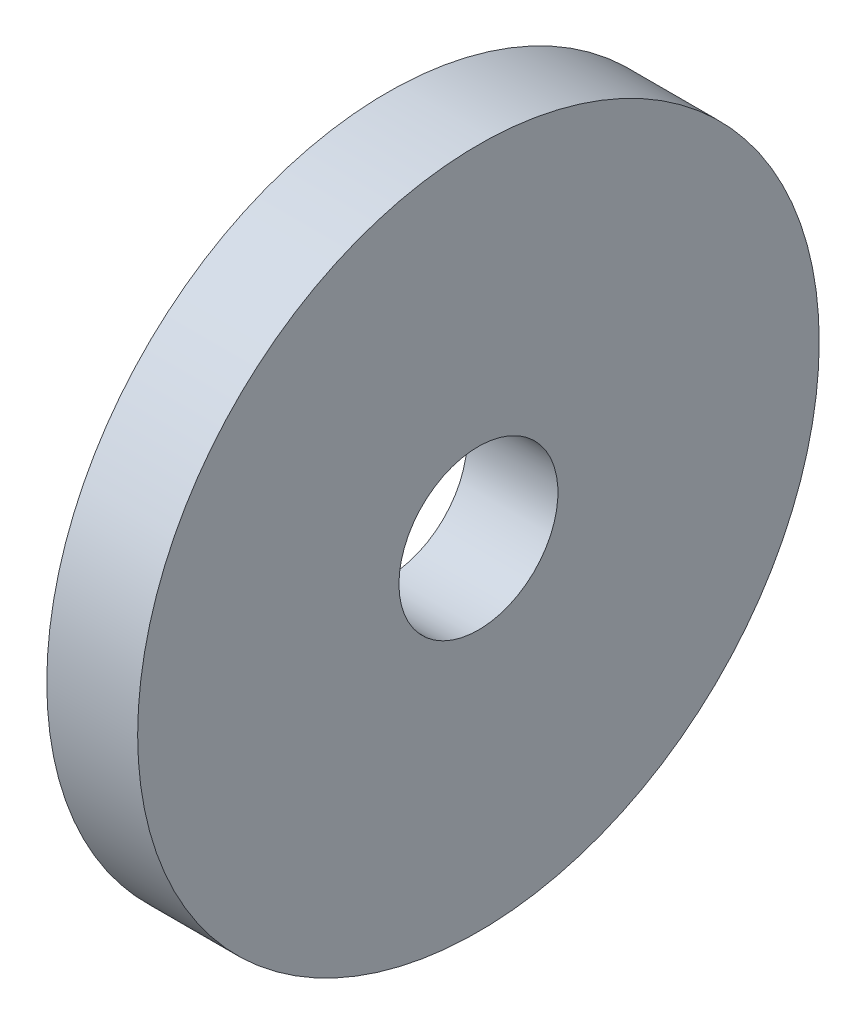
ISO-10303-21;
HEADER;
FILE_DESCRIPTION(('STEP AP214'),'2;1');
FILE_NAME('part.step','',(''),(''),'','','');
FILE_SCHEMA(('AUTOMOTIVE_DESIGN { 1 0 10303 214 1 1 1 1 }'));
ENDSEC;
DATA;
#1=APPLICATION_CONTEXT('core data for automotive mechanical design processes');
#2=APPLICATION_PROTOCOL_DEFINITION('international standard','automotive_design',2000,#1);
#3=PRODUCT_CONTEXT('',#1,'mechanical');
#4=PRODUCT('Part','Part','',(#3));
#5=PRODUCT_RELATED_PRODUCT_CATEGORY('part','',(#4));
#6=PRODUCT_DEFINITION_FORMATION('','',#4);
#7=PRODUCT_DEFINITION_CONTEXT('part definition',#1,'design');
#8=PRODUCT_DEFINITION('design','',#6,#7);
#9=PRODUCT_DEFINITION_SHAPE('','',#8);
#10=(LENGTH_UNIT() NAMED_UNIT(*) SI_UNIT(.MILLI.,.METRE.));
#11=(NAMED_UNIT(*) PLANE_ANGLE_UNIT() SI_UNIT($,.RADIAN.));
#12=(NAMED_UNIT(*) SI_UNIT($,.STERADIAN.) SOLID_ANGLE_UNIT());
#13=UNCERTAINTY_MEASURE_WITH_UNIT(LENGTH_MEASURE(1.E-05),#10,'distance_accuracy_value','');
#14=(GEOMETRIC_REPRESENTATION_CONTEXT(3) GLOBAL_UNCERTAINTY_ASSIGNED_CONTEXT((#13)) GLOBAL_UNIT_ASSIGNED_CONTEXT((#10,
#11,#12)) REPRESENTATION_CONTEXT('',''));
#15=CARTESIAN_POINT('',(0.,0.,0.));
#16=DIRECTION('',(0.,0.,1.));
#17=DIRECTION('',(1.,0.,0.));
#18=AXIS2_PLACEMENT_3D('',#15,#16,#17);
#19=CARTESIAN_POINT('',(-12.5747225647349,0.499999999999999,0.));
#20=DIRECTION('',(-1.,0.,0.));
#21=DIRECTION('',(0.,0.,1.));
#22=AXIS2_PLACEMENT_3D('',#19,#20,#21);
#23=CYLINDRICAL_SURFACE('',#22,15.);
#24=CARTESIAN_POINT('',(1.11022302462516E-13,0.499999999999999,0.));
#25=DIRECTION('',(-1.,0.,0.));
#26=DIRECTION('',(0.,0.,1.));
#27=AXIS2_PLACEMENT_3D('',#24,#25,#26);
#28=CIRCLE('',#27,15.);
#29=CARTESIAN_POINT('',(1.11022302462516E-13,0.499999999999999,15.));
#30=VERTEX_POINT('',#29);
#31=EDGE_CURVE('E10',#30,#30,#28,.T.);
#32=ORIENTED_EDGE('',*,*,#31,.F.);
#33=EDGE_LOOP('',(#32));
#34=FACE_BOUND('',#33,.T.);
#35=CARTESIAN_POINT('',(4.00000000000011,0.499999999999999,0.));
#36=DIRECTION('',(-1.,0.,0.));
#37=DIRECTION('',(0.,0.,1.));
#38=AXIS2_PLACEMENT_3D('',#35,#36,#37);
#39=CIRCLE('',#38,15.);
#40=CARTESIAN_POINT('',(4.00000000000011,0.499999999999999,15.));
#41=VERTEX_POINT('',#40);
#42=EDGE_CURVE('E45',#41,#41,#39,.T.);
#43=ORIENTED_EDGE('',*,*,#42,.T.);
#44=EDGE_LOOP('',(#43));
#45=FACE_BOUND('',#44,.T.);
#46=ADVANCED_FACE('F31',(#34,#45),#23,.T.);
#47=CARTESIAN_POINT('',(1.11022302462516E-13,4.,0.));
#48=DIRECTION('',(1.,0.,0.));
#49=DIRECTION('',(0.,0.,-1.));
#50=AXIS2_PLACEMENT_3D('',#47,#48,#49);
#51=PLANE('',#50);
#52=CARTESIAN_POINT('',(1.11022302462516E-13,0.499999999999999,0.));
#53=DIRECTION('',(-1.,0.,0.));
#54=DIRECTION('',(0.,0.,1.));
#55=AXIS2_PLACEMENT_3D('',#52,#53,#54);
#56=CIRCLE('',#55,3.5);
#57=CARTESIAN_POINT('',(1.11022302462516E-13,0.499999999999999,3.5));
#58=VERTEX_POINT('',#57);
#59=EDGE_CURVE('E37',#58,#58,#56,.T.);
#60=ORIENTED_EDGE('',*,*,#59,.F.);
#61=EDGE_LOOP('',(#60));
#62=FACE_BOUND('',#61,.T.);
#63=ORIENTED_EDGE('',*,*,#31,.T.);
#64=EDGE_LOOP('',(#63));
#65=FACE_BOUND('',#64,.T.);
#66=ADVANCED_FACE('F60',(#62,#65),#51,.F.);
#67=CARTESIAN_POINT('',(-12.5747225647349,0.499999999999999,0.));
#68=DIRECTION('',(-1.,0.,0.));
#69=DIRECTION('',(0.,0.,1.));
#70=AXIS2_PLACEMENT_3D('',#67,#68,#69);
#71=CYLINDRICAL_SURFACE('',#70,3.5);
#72=CARTESIAN_POINT('',(4.00000000000011,0.499999999999999,0.));
#73=DIRECTION('',(-1.,0.,0.));
#74=DIRECTION('',(0.,0.,1.));
#75=AXIS2_PLACEMENT_3D('',#72,#73,#74);
#76=CIRCLE('',#75,3.5);
#77=CARTESIAN_POINT('',(4.00000000000011,0.499999999999999,3.5));
#78=VERTEX_POINT('',#77);
#79=EDGE_CURVE('E41',#78,#78,#76,.T.);
#80=ORIENTED_EDGE('',*,*,#79,.F.);
#81=EDGE_LOOP('',(#80));
#82=FACE_BOUND('',#81,.T.);
#83=ORIENTED_EDGE('',*,*,#59,.T.);
#84=EDGE_LOOP('',(#83));
#85=FACE_BOUND('',#84,.T.);
#86=ADVANCED_FACE('F55',(#82,#85),#71,.F.);
#87=CARTESIAN_POINT('',(4.00000000000011,15.5,0.));
#88=DIRECTION('',(-1.,0.,0.));
#89=DIRECTION('',(0.,0.,1.));
#90=AXIS2_PLACEMENT_3D('',#87,#88,#89);
#91=PLANE('',#90);
#92=ORIENTED_EDGE('',*,*,#42,.F.);
#93=EDGE_LOOP('',(#92));
#94=FACE_BOUND('',#93,.T.);
#95=ORIENTED_EDGE('',*,*,#79,.T.);
#96=EDGE_LOOP('',(#95));
#97=FACE_BOUND('',#96,.T.);
#98=ADVANCED_FACE('F52',(#94,#97),#91,.F.);
#99=CLOSED_SHELL('',(#46,#66,#86,#98));
#100=MANIFOLD_SOLID_BREP('B2',#99);
#101=ADVANCED_BREP_SHAPE_REPRESENTATION('',(#18,#100),#14);
#102=SHAPE_DEFINITION_REPRESENTATION(#9,#101);
ENDSEC;
END-ISO-10303-21;
